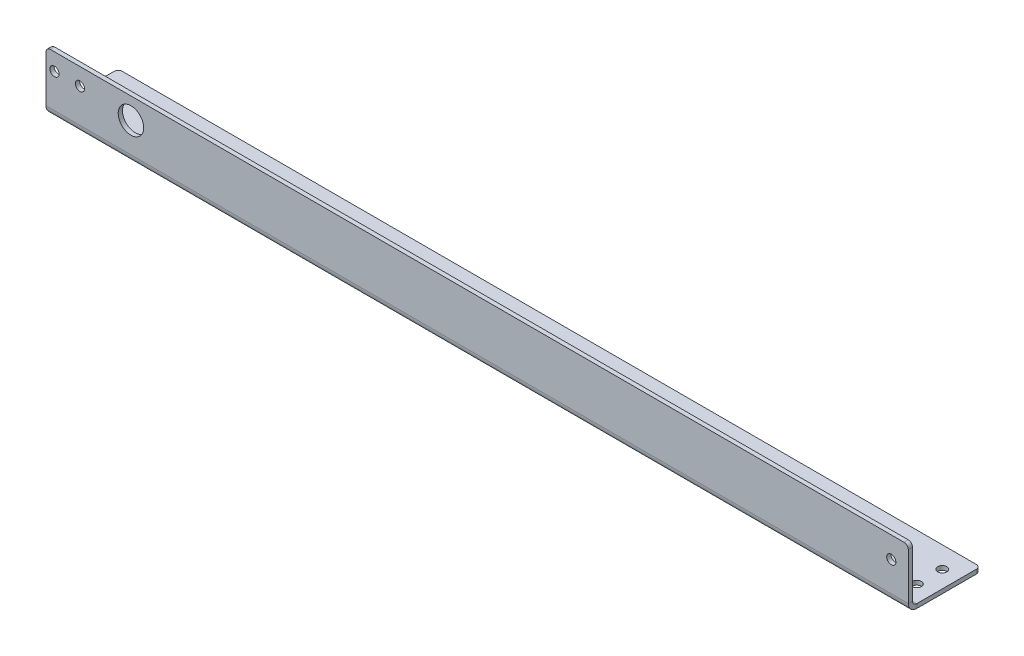
ISO-10303-21;
HEADER;
FILE_DESCRIPTION(('STEP AP214'),'2;1');
FILE_NAME('part.step','',(''),(''),'','','');
FILE_SCHEMA(('AUTOMOTIVE_DESIGN { 1 0 10303 214 1 1 1 1 }'));
ENDSEC;
DATA;
#1=APPLICATION_CONTEXT('core data for automotive mechanical design processes');
#2=APPLICATION_PROTOCOL_DEFINITION('international standard','automotive_design',2000,#1);
#3=PRODUCT_CONTEXT('',#1,'mechanical');
#4=PRODUCT('Part','Part','',(#3));
#5=PRODUCT_RELATED_PRODUCT_CATEGORY('part','',(#4));
#6=PRODUCT_DEFINITION_FORMATION('','',#4);
#7=PRODUCT_DEFINITION_CONTEXT('part definition',#1,'design');
#8=PRODUCT_DEFINITION('design','',#6,#7);
#9=PRODUCT_DEFINITION_SHAPE('','',#8);
#10=(LENGTH_UNIT() NAMED_UNIT(*) SI_UNIT(.MILLI.,.METRE.));
#11=(NAMED_UNIT(*) PLANE_ANGLE_UNIT() SI_UNIT($,.RADIAN.));
#12=(NAMED_UNIT(*) SI_UNIT($,.STERADIAN.) SOLID_ANGLE_UNIT());
#13=UNCERTAINTY_MEASURE_WITH_UNIT(LENGTH_MEASURE(1.E-05),#10,'distance_accuracy_value','');
#14=(GEOMETRIC_REPRESENTATION_CONTEXT(3) GLOBAL_UNCERTAINTY_ASSIGNED_CONTEXT((#13)) GLOBAL_UNIT_ASSIGNED_CONTEXT((#10,
#11,#12)) REPRESENTATION_CONTEXT('',''));
#15=CARTESIAN_POINT('',(0.,0.,0.));
#16=DIRECTION('',(0.,0.,1.));
#17=DIRECTION('',(1.,0.,0.));
#18=AXIS2_PLACEMENT_3D('',#15,#16,#17);
#19=CARTESIAN_POINT('',(644.525,6.35,0.));
#20=DIRECTION('',(1.,0.,0.));
#21=DIRECTION('',(0.,0.,-1.));
#22=AXIS2_PLACEMENT_3D('',#19,#20,#21);
#23=PLANE('',#22);
#24=DIRECTION('',(0.,0.,-1.));
#25=VECTOR('',#24,1.);
#26=CARTESIAN_POINT('',(644.525,6.35,0.));
#27=LINE('',#26,#25);
#28=CARTESIAN_POINT('',(644.525,6.35,0.));
#29=VERTEX_POINT('',#28);
#30=CARTESIAN_POINT('',(644.525,6.35,-3.175));
#31=VERTEX_POINT('',#30);
#32=EDGE_CURVE('E179',#29,#31,#27,.T.);
#33=ORIENTED_EDGE('',*,*,#32,.F.);
#34=CARTESIAN_POINT('',(644.525,6.35,-6.35));
#35=DIRECTION('',(1.,0.,0.));
#36=DIRECTION('',(0.,0.,-1.));
#37=AXIS2_PLACEMENT_3D('',#34,#35,#36);
#38=CIRCLE('',#37,6.35);
#39=CARTESIAN_POINT('',(644.525,0.,-6.35));
#40=VERTEX_POINT('',#39);
#41=EDGE_CURVE('E183',#40,#29,#38,.F.);
#42=ORIENTED_EDGE('',*,*,#41,.F.);
#43=DIRECTION('',(0.,-1.,0.));
#44=VECTOR('',#43,1.);
#45=CARTESIAN_POINT('',(644.525,3.175,-6.35));
#46=LINE('',#45,#44);
#47=CARTESIAN_POINT('',(644.525,3.175,-6.35));
#48=VERTEX_POINT('',#47);
#49=EDGE_CURVE('E188',#48,#40,#46,.T.);
#50=ORIENTED_EDGE('',*,*,#49,.F.);
#51=CARTESIAN_POINT('',(644.525,6.35,-6.35));
#52=DIRECTION('',(1.,0.,0.));
#53=DIRECTION('',(0.,0.,-1.));
#54=AXIS2_PLACEMENT_3D('',#51,#52,#53);
#55=CIRCLE('',#54,3.175);
#56=EDGE_CURVE('E185',#48,#31,#55,.F.);
#57=ORIENTED_EDGE('',*,*,#56,.T.);
#58=EDGE_LOOP('',(#33,#42,#50,#57));
#59=FACE_BOUND('',#58,.T.);
#60=ADVANCED_FACE('F86',(#59),#23,.T.);
#61=CARTESIAN_POINT('',(644.525,3.175,-6.35));
#62=DIRECTION('',(1.,0.,0.));
#63=DIRECTION('',(0.,0.,-1.));
#64=AXIS2_PLACEMENT_3D('',#61,#62,#63);
#65=PLANE('',#64);
#66=DIRECTION('',(0.,1.,0.));
#67=VECTOR('',#66,1.);
#68=CARTESIAN_POINT('',(644.525,0.,-3.175));
#69=LINE('',#68,#67);
#70=CARTESIAN_POINT('',(644.525,41.275,-3.175));
#71=VERTEX_POINT('',#70);
#72=EDGE_CURVE('E203',#31,#71,#69,.T.);
#73=ORIENTED_EDGE('',*,*,#72,.T.);
#74=DIRECTION('',(0.,0.,-1.));
#75=VECTOR('',#74,1.);
#76=CARTESIAN_POINT('',(644.525,41.275,-6.35));
#77=LINE('',#76,#75);
#78=CARTESIAN_POINT('',(644.525,41.275,0.));
#79=VERTEX_POINT('',#78);
#80=EDGE_CURVE('E109',#71,#79,#77,.F.);
#81=ORIENTED_EDGE('',*,*,#80,.T.);
#82=DIRECTION('',(0.,1.,0.));
#83=VECTOR('',#82,1.);
#84=CARTESIAN_POINT('',(644.525,0.,0.));
#85=LINE('',#84,#83);
#86=EDGE_CURVE('E193',#29,#79,#85,.T.);
#87=ORIENTED_EDGE('',*,*,#86,.F.);
#88=ORIENTED_EDGE('',*,*,#32,.T.);
#89=EDGE_LOOP('',(#73,#81,#87,#88));
#90=FACE_BOUND('',#89,.T.);
#91=ADVANCED_FACE('F202',(#90),#65,.T.);
#92=CARTESIAN_POINT('',(0.,0.,-6.35));
#93=DIRECTION('',(-1.,0.,0.));
#94=DIRECTION('',(0.,0.,1.));
#95=AXIS2_PLACEMENT_3D('',#92,#93,#94);
#96=PLANE('',#95);
#97=DIRECTION('',(0.,1.,0.));
#98=VECTOR('',#97,1.);
#99=CARTESIAN_POINT('',(0.,0.,-6.35));
#100=LINE('',#99,#98);
#101=CARTESIAN_POINT('',(0.,0.,-6.35));
#102=VERTEX_POINT('',#101);
#103=CARTESIAN_POINT('',(0.,3.175,-6.35));
#104=VERTEX_POINT('',#103);
#105=EDGE_CURVE('E249',#102,#104,#100,.T.);
#106=ORIENTED_EDGE('',*,*,#105,.F.);
#107=CARTESIAN_POINT('',(0.,6.35,-6.35));
#108=DIRECTION('',(1.,0.,0.));
#109=DIRECTION('',(0.,0.,-1.));
#110=AXIS2_PLACEMENT_3D('',#107,#108,#109);
#111=CIRCLE('',#110,6.35);
#112=CARTESIAN_POINT('',(0.,6.35,0.));
#113=VERTEX_POINT('',#112);
#114=EDGE_CURVE('E222',#102,#113,#111,.F.);
#115=ORIENTED_EDGE('',*,*,#114,.T.);
#116=DIRECTION('',(0.,0.,1.));
#117=VECTOR('',#116,1.);
#118=CARTESIAN_POINT('',(0.,6.35,-3.175));
#119=LINE('',#118,#117);
#120=CARTESIAN_POINT('',(0.,6.35,-3.175));
#121=VERTEX_POINT('',#120);
#122=EDGE_CURVE('E247',#121,#113,#119,.T.);
#123=ORIENTED_EDGE('',*,*,#122,.F.);
#124=CARTESIAN_POINT('',(0.,6.35,-6.35));
#125=DIRECTION('',(1.,0.,0.));
#126=DIRECTION('',(0.,0.,-1.));
#127=AXIS2_PLACEMENT_3D('',#124,#125,#126);
#128=CIRCLE('',#127,3.175);
#129=EDGE_CURVE('E228',#104,#121,#128,.F.);
#130=ORIENTED_EDGE('',*,*,#129,.F.);
#131=EDGE_LOOP('',(#106,#115,#123,#130));
#132=FACE_BOUND('',#131,.T.);
#133=ADVANCED_FACE('F296',(#132),#96,.T.);
#134=CARTESIAN_POINT('',(0.,6.35,-3.175));
#135=DIRECTION('',(-1.,0.,0.));
#136=DIRECTION('',(0.,0.,1.));
#137=AXIS2_PLACEMENT_3D('',#134,#135,#136);
#138=PLANE('',#137);
#139=DIRECTION('',(0.,0.,1.));
#140=VECTOR('',#139,1.);
#141=CARTESIAN_POINT('',(0.,3.175,-53.975));
#142=LINE('',#141,#140);
#143=CARTESIAN_POINT('',(0.,3.175,-50.8));
#144=VERTEX_POINT('',#143);
#145=EDGE_CURVE('E226',#144,#104,#142,.T.);
#146=ORIENTED_EDGE('',*,*,#145,.F.);
#147=DIRECTION('',(0.,-1.,0.));
#148=VECTOR('',#147,1.);
#149=CARTESIAN_POINT('',(0.,6.35,-50.8));
#150=LINE('',#149,#148);
#151=CARTESIAN_POINT('',(0.,0.,-50.8));
#152=VERTEX_POINT('',#151);
#153=EDGE_CURVE('E12',#144,#152,#150,.T.);
#154=ORIENTED_EDGE('',*,*,#153,.T.);
#155=DIRECTION('',(0.,0.,1.));
#156=VECTOR('',#155,1.);
#157=CARTESIAN_POINT('',(0.,0.,-53.975));
#158=LINE('',#157,#156);
#159=EDGE_CURVE('E224',#152,#102,#158,.T.);
#160=ORIENTED_EDGE('',*,*,#159,.T.);
#161=ORIENTED_EDGE('',*,*,#105,.T.);
#162=EDGE_LOOP('',(#146,#154,#160,#161));
#163=FACE_BOUND('',#162,.T.);
#164=ADVANCED_FACE('F313',(#163),#138,.T.);
#165=CARTESIAN_POINT('',(644.525,0.,-3.175));
#166=DIRECTION('',(0.,0.,1.));
#167=DIRECTION('',(1.,0.,0.));
#168=AXIS2_PLACEMENT_3D('',#165,#166,#167);
#169=PLANE('',#168);
#170=CARTESIAN_POINT('',(631.825,28.575,-3.175));
#171=DIRECTION('',(0.,0.,1.));
#172=DIRECTION('',(1.,0.,0.));
#173=AXIS2_PLACEMENT_3D('',#170,#171,#172);
#174=CIRCLE('',#173,3.429);
#175=CARTESIAN_POINT('',(635.254,28.575,-3.175));
#176=VERTEX_POINT('',#175);
#177=EDGE_CURVE('E445',#176,#176,#174,.T.);
#178=ORIENTED_EDGE('',*,*,#177,.T.);
#179=EDGE_LOOP('',(#178));
#180=FACE_BOUND('',#179,.T.);
#181=CARTESIAN_POINT('',(25.4,31.75,-3.175));
#182=DIRECTION('',(0.,0.,1.));
#183=DIRECTION('',(1.,0.,0.));
#184=AXIS2_PLACEMENT_3D('',#181,#182,#183);
#185=CIRCLE('',#184,3.42899999999999);
#186=CARTESIAN_POINT('',(28.829,31.75,-3.175));
#187=VERTEX_POINT('',#186);
#188=EDGE_CURVE('E404',#187,#187,#185,.T.);
#189=ORIENTED_EDGE('',*,*,#188,.T.);
#190=EDGE_LOOP('',(#189));
#191=FACE_BOUND('',#190,.T.);
#192=CARTESIAN_POINT('',(6.35,31.75,-3.175));
#193=DIRECTION('',(0.,0.,1.));
#194=DIRECTION('',(1.,0.,0.));
#195=AXIS2_PLACEMENT_3D('',#192,#193,#194);
#196=CIRCLE('',#195,3.429);
#197=CARTESIAN_POINT('',(9.779,31.75,-3.175));
#198=VERTEX_POINT('',#197);
#199=EDGE_CURVE('E421',#198,#198,#196,.T.);
#200=ORIENTED_EDGE('',*,*,#199,.T.);
#201=EDGE_LOOP('',(#200));
#202=FACE_BOUND('',#201,.T.);
#203=CARTESIAN_POINT('',(63.5,28.575,-3.175));
#204=DIRECTION('',(0.,0.,1.));
#205=DIRECTION('',(1.,0.,0.));
#206=AXIS2_PLACEMENT_3D('',#203,#204,#205);
#207=CIRCLE('',#206,9.52500000000001);
#208=CARTESIAN_POINT('',(73.025,28.575,-3.175));
#209=VERTEX_POINT('',#208);
#210=EDGE_CURVE('E414',#209,#209,#207,.T.);
#211=ORIENTED_EDGE('',*,*,#210,.T.);
#212=EDGE_LOOP('',(#211));
#213=FACE_BOUND('',#212,.T.);
#214=DIRECTION('',(-1.,0.,0.));
#215=VECTOR('',#214,1.);
#216=CARTESIAN_POINT('',(644.525,44.45,-3.175));
#217=LINE('',#216,#215);
#218=CARTESIAN_POINT('',(641.35,44.45,-3.175));
#219=VERTEX_POINT('',#218);
#220=CARTESIAN_POINT('',(3.17500000000004,44.45,-3.175));
#221=VERTEX_POINT('',#220);
#222=EDGE_CURVE('E244',#219,#221,#217,.T.);
#223=ORIENTED_EDGE('',*,*,#222,.F.);
#224=CARTESIAN_POINT('',(641.35,41.275,-3.175));
#225=DIRECTION('',(0.,0.,1.));
#226=DIRECTION('',(1.,0.,0.));
#227=AXIS2_PLACEMENT_3D('',#224,#225,#226);
#228=CIRCLE('',#227,3.175);
#229=EDGE_CURVE('E275',#219,#71,#228,.F.);
#230=ORIENTED_EDGE('',*,*,#229,.T.);
#231=ORIENTED_EDGE('',*,*,#72,.F.);
#232=DIRECTION('',(-1.,0.,0.));
#233=VECTOR('',#232,1.);
#234=CARTESIAN_POINT('',(644.525,6.35,-3.175));
#235=LINE('',#234,#233);
#236=EDGE_CURVE('E216',#31,#121,#235,.T.);
#237=ORIENTED_EDGE('',*,*,#236,.T.);
#238=DIRECTION('',(0.,1.,0.));
#239=VECTOR('',#238,1.);
#240=CARTESIAN_POINT('',(0.,0.,-3.175));
#241=LINE('',#240,#239);
#242=CARTESIAN_POINT('',(0.,41.275,-3.175));
#243=VERTEX_POINT('',#242);
#244=EDGE_CURVE('E217',#121,#243,#241,.T.);
#245=ORIENTED_EDGE('',*,*,#244,.T.);
#246=CARTESIAN_POINT('',(3.175,41.275,-3.175));
#247=DIRECTION('',(0.,0.,1.));
#248=DIRECTION('',(1.,0.,0.));
#249=AXIS2_PLACEMENT_3D('',#246,#247,#248);
#250=CIRCLE('',#249,3.175);
#251=EDGE_CURVE('E273',#243,#221,#250,.F.);
#252=ORIENTED_EDGE('',*,*,#251,.T.);
#253=EDGE_LOOP('',(#223,#230,#231,#237,#245,#252));
#254=FACE_BOUND('',#253,.T.);
#255=ADVANCED_FACE('F288',(#180,#191,#202,#213,#254),#169,.F.);
#256=CARTESIAN_POINT('',(644.525,44.45,0.));
#257=DIRECTION('',(0.,1.,0.));
#258=DIRECTION('',(0.,0.,1.));
#259=AXIS2_PLACEMENT_3D('',#256,#257,#258);
#260=PLANE('',#259);
#261=DIRECTION('',(-1.,0.,0.));
#262=VECTOR('',#261,1.);
#263=CARTESIAN_POINT('',(644.525,44.45,0.));
#264=LINE('',#263,#262);
#265=CARTESIAN_POINT('',(641.35,44.45,0.));
#266=VERTEX_POINT('',#265);
#267=CARTESIAN_POINT('',(3.17500000000004,44.45,0.));
#268=VERTEX_POINT('',#267);
#269=EDGE_CURVE('E199',#266,#268,#264,.T.);
#270=ORIENTED_EDGE('',*,*,#269,.F.);
#271=DIRECTION('',(0.,0.,-1.));
#272=VECTOR('',#271,1.);
#273=CARTESIAN_POINT('',(641.35,44.45,0.));
#274=LINE('',#273,#272);
#275=EDGE_CURVE('E270',#266,#219,#274,.T.);
#276=ORIENTED_EDGE('',*,*,#275,.T.);
#277=ORIENTED_EDGE('',*,*,#222,.T.);
#278=DIRECTION('',(0.,0.,-1.));
#279=VECTOR('',#278,1.);
#280=CARTESIAN_POINT('',(3.175,44.45,0.));
#281=LINE('',#280,#279);
#282=EDGE_CURVE('E268',#221,#268,#281,.F.);
#283=ORIENTED_EDGE('',*,*,#282,.T.);
#284=EDGE_LOOP('',(#270,#276,#277,#283));
#285=FACE_BOUND('',#284,.T.);
#286=ADVANCED_FACE('F349',(#285),#260,.T.);
#287=CARTESIAN_POINT('',(644.525,0.,0.));
#288=DIRECTION('',(0.,0.,1.));
#289=DIRECTION('',(1.,0.,0.));
#290=AXIS2_PLACEMENT_3D('',#287,#288,#289);
#291=PLANE('',#290);
#292=CARTESIAN_POINT('',(631.825,28.575,0.));
#293=DIRECTION('',(0.,0.,1.));
#294=DIRECTION('',(1.,0.,0.));
#295=AXIS2_PLACEMENT_3D('',#292,#293,#294);
#296=CIRCLE('',#295,3.429);
#297=CARTESIAN_POINT('',(635.254,28.575,0.));
#298=VERTEX_POINT('',#297);
#299=EDGE_CURVE('E417',#298,#298,#296,.T.);
#300=ORIENTED_EDGE('',*,*,#299,.F.);
#301=EDGE_LOOP('',(#300));
#302=FACE_BOUND('',#301,.T.);
#303=CARTESIAN_POINT('',(25.4,31.75,0.));
#304=DIRECTION('',(0.,0.,1.));
#305=DIRECTION('',(1.,0.,0.));
#306=AXIS2_PLACEMENT_3D('',#303,#304,#305);
#307=CIRCLE('',#306,3.42899999999999);
#308=CARTESIAN_POINT('',(28.829,31.75,0.));
#309=VERTEX_POINT('',#308);
#310=EDGE_CURVE('E407',#309,#309,#307,.T.);
#311=ORIENTED_EDGE('',*,*,#310,.F.);
#312=EDGE_LOOP('',(#311));
#313=FACE_BOUND('',#312,.T.);
#314=CARTESIAN_POINT('',(6.35,31.75,0.));
#315=DIRECTION('',(0.,0.,1.));
#316=DIRECTION('',(1.,0.,0.));
#317=AXIS2_PLACEMENT_3D('',#314,#315,#316);
#318=CIRCLE('',#317,3.429);
#319=CARTESIAN_POINT('',(9.779,31.75,0.));
#320=VERTEX_POINT('',#319);
#321=EDGE_CURVE('E410',#320,#320,#318,.T.);
#322=ORIENTED_EDGE('',*,*,#321,.F.);
#323=EDGE_LOOP('',(#322));
#324=FACE_BOUND('',#323,.T.);
#325=CARTESIAN_POINT('',(63.5,28.575,0.));
#326=DIRECTION('',(0.,0.,1.));
#327=DIRECTION('',(1.,0.,0.));
#328=AXIS2_PLACEMENT_3D('',#325,#326,#327);
#329=CIRCLE('',#328,9.52500000000001);
#330=CARTESIAN_POINT('',(73.025,28.575,0.));
#331=VERTEX_POINT('',#330);
#332=EDGE_CURVE('E418',#331,#331,#329,.T.);
#333=ORIENTED_EDGE('',*,*,#332,.F.);
#334=EDGE_LOOP('',(#333));
#335=FACE_BOUND('',#334,.T.);
#336=ORIENTED_EDGE('',*,*,#86,.T.);
#337=CARTESIAN_POINT('',(641.35,41.275,0.));
#338=DIRECTION('',(0.,0.,1.));
#339=DIRECTION('',(1.,0.,0.));
#340=AXIS2_PLACEMENT_3D('',#337,#338,#339);
#341=CIRCLE('',#340,3.175);
#342=EDGE_CURVE('E279',#79,#266,#341,.T.);
#343=ORIENTED_EDGE('',*,*,#342,.T.);
#344=ORIENTED_EDGE('',*,*,#269,.T.);
#345=CARTESIAN_POINT('',(3.175,41.275,0.));
#346=DIRECTION('',(0.,0.,1.));
#347=DIRECTION('',(1.,0.,0.));
#348=AXIS2_PLACEMENT_3D('',#345,#346,#347);
#349=CIRCLE('',#348,3.175);
#350=CARTESIAN_POINT('',(0.,41.275,0.));
#351=VERTEX_POINT('',#350);
#352=EDGE_CURVE('E101',#268,#351,#349,.T.);
#353=ORIENTED_EDGE('',*,*,#352,.T.);
#354=DIRECTION('',(0.,1.,0.));
#355=VECTOR('',#354,1.);
#356=CARTESIAN_POINT('',(0.,0.,0.));
#357=LINE('',#356,#355);
#358=EDGE_CURVE('E195',#113,#351,#357,.T.);
#359=ORIENTED_EDGE('',*,*,#358,.F.);
#360=DIRECTION('',(-1.,0.,0.));
#361=VECTOR('',#360,1.);
#362=CARTESIAN_POINT('',(644.525,6.35,0.));
#363=LINE('',#362,#361);
#364=EDGE_CURVE('E191',#29,#113,#363,.T.);
#365=ORIENTED_EDGE('',*,*,#364,.F.);
#366=EDGE_LOOP('',(#336,#343,#344,#353,#359,#365));
#367=FACE_BOUND('',#366,.T.);
#368=ADVANCED_FACE('F192',(#302,#313,#324,#335,#367),#291,.T.);
#369=CARTESIAN_POINT('',(644.525,6.35,-6.35));
#370=DIRECTION('',(-1.,0.,0.));
#371=DIRECTION('',(0.,0.,1.));
#372=AXIS2_PLACEMENT_3D('',#369,#370,#371);
#373=CYLINDRICAL_SURFACE('',#372,6.35);
#374=ORIENTED_EDGE('',*,*,#114,.F.);
#375=DIRECTION('',(-1.,0.,0.));
#376=VECTOR('',#375,1.);
#377=CARTESIAN_POINT('',(644.525,0.,-6.35));
#378=LINE('',#377,#376);
#379=EDGE_CURVE('E200',#40,#102,#378,.T.);
#380=ORIENTED_EDGE('',*,*,#379,.F.);
#381=ORIENTED_EDGE('',*,*,#41,.T.);
#382=ORIENTED_EDGE('',*,*,#364,.T.);
#383=EDGE_LOOP('',(#374,#380,#381,#382));
#384=FACE_BOUND('',#383,.T.);
#385=ADVANCED_FACE('F206',(#384),#373,.T.);
#386=CARTESIAN_POINT('',(644.525,0.,-53.975));
#387=DIRECTION('',(0.,-1.,0.));
#388=DIRECTION('',(0.,0.,-1.));
#389=AXIS2_PLACEMENT_3D('',#386,#387,#388);
#390=PLANE('',#389);
#391=CARTESIAN_POINT('',(12.7,0.,-19.05));
#392=DIRECTION('',(0.,-1.,0.));
#393=DIRECTION('',(0.,0.,-1.));
#394=AXIS2_PLACEMENT_3D('',#391,#392,#393);
#395=CIRCLE('',#394,3.429);
#396=CARTESIAN_POINT('',(12.7,0.,-22.479));
#397=VERTEX_POINT('',#396);
#398=EDGE_CURVE('E442',#397,#397,#395,.T.);
#399=ORIENTED_EDGE('',*,*,#398,.F.);
#400=EDGE_LOOP('',(#399));
#401=FACE_BOUND('',#400,.T.);
#402=CARTESIAN_POINT('',(12.7,0.,-38.1));
#403=DIRECTION('',(0.,-1.,0.));
#404=DIRECTION('',(0.,0.,-1.));
#405=AXIS2_PLACEMENT_3D('',#402,#403,#404);
#406=CIRCLE('',#405,3.429);
#407=CARTESIAN_POINT('',(12.7,0.,-41.529));
#408=VERTEX_POINT('',#407);
#409=EDGE_CURVE('E436',#408,#408,#406,.T.);
#410=ORIENTED_EDGE('',*,*,#409,.F.);
#411=EDGE_LOOP('',(#410));
#412=FACE_BOUND('',#411,.T.);
#413=CARTESIAN_POINT('',(631.825,0.,-38.1));
#414=DIRECTION('',(0.,-1.,0.));
#415=DIRECTION('',(0.,0.,-1.));
#416=AXIS2_PLACEMENT_3D('',#413,#414,#415);
#417=CIRCLE('',#416,3.429);
#418=CARTESIAN_POINT('',(631.825,0.,-41.529));
#419=VERTEX_POINT('',#418);
#420=EDGE_CURVE('E430',#419,#419,#417,.T.);
#421=ORIENTED_EDGE('',*,*,#420,.F.);
#422=EDGE_LOOP('',(#421));
#423=FACE_BOUND('',#422,.T.);
#424=CARTESIAN_POINT('',(631.825,0.,-19.05));
#425=DIRECTION('',(0.,-1.,0.));
#426=DIRECTION('',(0.,0.,-1.));
#427=AXIS2_PLACEMENT_3D('',#424,#425,#426);
#428=CIRCLE('',#427,3.429);
#429=CARTESIAN_POINT('',(631.825,0.,-22.479));
#430=VERTEX_POINT('',#429);
#431=EDGE_CURVE('E429',#430,#430,#428,.T.);
#432=ORIENTED_EDGE('',*,*,#431,.F.);
#433=EDGE_LOOP('',(#432));
#434=FACE_BOUND('',#433,.T.);
#435=DIRECTION('',(-1.,0.,0.));
#436=VECTOR('',#435,1.);
#437=CARTESIAN_POINT('',(644.525,0.,-53.975));
#438=LINE('',#437,#436);
#439=CARTESIAN_POINT('',(641.35,0.,-53.975));
#440=VERTEX_POINT('',#439);
#441=CARTESIAN_POINT('',(3.17500000000004,0.,-53.975));
#442=VERTEX_POINT('',#441);
#443=EDGE_CURVE('E239',#440,#442,#438,.T.);
#444=ORIENTED_EDGE('',*,*,#443,.F.);
#445=CARTESIAN_POINT('',(641.35,0.,-50.8));
#446=DIRECTION('',(0.,-1.,0.));
#447=DIRECTION('',(0.,0.,-1.));
#448=AXIS2_PLACEMENT_3D('',#445,#446,#447);
#449=CIRCLE('',#448,3.175);
#450=CARTESIAN_POINT('',(644.525,0.,-50.8));
#451=VERTEX_POINT('',#450);
#452=EDGE_CURVE('E260',#440,#451,#449,.T.);
#453=ORIENTED_EDGE('',*,*,#452,.T.);
#454=DIRECTION('',(0.,0.,1.));
#455=VECTOR('',#454,1.);
#456=CARTESIAN_POINT('',(644.525,0.,-53.975));
#457=LINE('',#456,#455);
#458=EDGE_CURVE('E208',#451,#40,#457,.T.);
#459=ORIENTED_EDGE('',*,*,#458,.T.);
#460=ORIENTED_EDGE('',*,*,#379,.T.);
#461=ORIENTED_EDGE('',*,*,#159,.F.);
#462=CARTESIAN_POINT('',(3.175,0.,-50.8));
#463=DIRECTION('',(0.,-1.,0.));
#464=DIRECTION('',(0.,0.,-1.));
#465=AXIS2_PLACEMENT_3D('',#462,#463,#464);
#466=CIRCLE('',#465,3.175);
#467=EDGE_CURVE('E258',#152,#442,#466,.T.);
#468=ORIENTED_EDGE('',*,*,#467,.T.);
#469=EDGE_LOOP('',(#444,#453,#459,#460,#461,#468));
#470=FACE_BOUND('',#469,.T.);
#471=ADVANCED_FACE('F302',(#401,#412,#423,#434,#470),#390,.T.);
#472=CARTESIAN_POINT('',(644.525,3.175,-53.975));
#473=DIRECTION('',(0.,0.,-1.));
#474=DIRECTION('',(-1.,0.,0.));
#475=AXIS2_PLACEMENT_3D('',#472,#473,#474);
#476=PLANE('',#475);
#477=DIRECTION('',(-1.,0.,0.));
#478=VECTOR('',#477,1.);
#479=CARTESIAN_POINT('',(644.525,3.175,-53.975));
#480=LINE('',#479,#478);
#481=CARTESIAN_POINT('',(641.35,3.175,-53.975));
#482=VERTEX_POINT('',#481);
#483=CARTESIAN_POINT('',(3.17500000000004,3.175,-53.975));
#484=VERTEX_POINT('',#483);
#485=EDGE_CURVE('E236',#482,#484,#480,.T.);
#486=ORIENTED_EDGE('',*,*,#485,.F.);
#487=DIRECTION('',(0.,-1.,0.));
#488=VECTOR('',#487,1.);
#489=CARTESIAN_POINT('',(641.35,3.175,-53.975));
#490=LINE('',#489,#488);
#491=EDGE_CURVE('E255',#482,#440,#490,.T.);
#492=ORIENTED_EDGE('',*,*,#491,.T.);
#493=ORIENTED_EDGE('',*,*,#443,.T.);
#494=DIRECTION('',(0.,-1.,0.));
#495=VECTOR('',#494,1.);
#496=CARTESIAN_POINT('',(3.17500000000004,3.175,-53.975));
#497=LINE('',#496,#495);
#498=EDGE_CURVE('E187',#442,#484,#497,.F.);
#499=ORIENTED_EDGE('',*,*,#498,.T.);
#500=EDGE_LOOP('',(#486,#492,#493,#499));
#501=FACE_BOUND('',#500,.T.);
#502=ADVANCED_FACE('F318',(#501),#476,.T.);
#503=CARTESIAN_POINT('',(644.525,3.175,-53.975));
#504=DIRECTION('',(0.,-1.,0.));
#505=DIRECTION('',(0.,0.,-1.));
#506=AXIS2_PLACEMENT_3D('',#503,#504,#505);
#507=PLANE('',#506);
#508=CARTESIAN_POINT('',(12.7,3.175,-19.05));
#509=DIRECTION('',(0.,-1.,0.));
#510=DIRECTION('',(0.,0.,-1.));
#511=AXIS2_PLACEMENT_3D('',#508,#509,#510);
#512=CIRCLE('',#511,3.429);
#513=CARTESIAN_POINT('',(12.7,3.175,-22.479));
#514=VERTEX_POINT('',#513);
#515=EDGE_CURVE('E439',#514,#514,#512,.T.);
#516=ORIENTED_EDGE('',*,*,#515,.T.);
#517=EDGE_LOOP('',(#516));
#518=FACE_BOUND('',#517,.T.);
#519=CARTESIAN_POINT('',(12.7,3.175,-38.1));
#520=DIRECTION('',(0.,-1.,0.));
#521=DIRECTION('',(0.,0.,-1.));
#522=AXIS2_PLACEMENT_3D('',#519,#520,#521);
#523=CIRCLE('',#522,3.429);
#524=CARTESIAN_POINT('',(12.7,3.175,-41.529));
#525=VERTEX_POINT('',#524);
#526=EDGE_CURVE('E433',#525,#525,#523,.T.);
#527=ORIENTED_EDGE('',*,*,#526,.T.);
#528=EDGE_LOOP('',(#527));
#529=FACE_BOUND('',#528,.T.);
#530=CARTESIAN_POINT('',(631.825,3.175,-38.1));
#531=DIRECTION('',(0.,-1.,0.));
#532=DIRECTION('',(0.,0.,-1.));
#533=AXIS2_PLACEMENT_3D('',#530,#531,#532);
#534=CIRCLE('',#533,3.429);
#535=CARTESIAN_POINT('',(631.825,3.175,-41.529));
#536=VERTEX_POINT('',#535);
#537=EDGE_CURVE('E426',#536,#536,#534,.T.);
#538=ORIENTED_EDGE('',*,*,#537,.T.);
#539=EDGE_LOOP('',(#538));
#540=FACE_BOUND('',#539,.T.);
#541=CARTESIAN_POINT('',(631.825,3.175,-19.05));
#542=DIRECTION('',(0.,-1.,0.));
#543=DIRECTION('',(0.,0.,-1.));
#544=AXIS2_PLACEMENT_3D('',#541,#542,#543);
#545=CIRCLE('',#544,3.429);
#546=CARTESIAN_POINT('',(631.825,3.175,-22.479));
#547=VERTEX_POINT('',#546);
#548=EDGE_CURVE('E220',#547,#547,#545,.T.);
#549=ORIENTED_EDGE('',*,*,#548,.T.);
#550=EDGE_LOOP('',(#549));
#551=FACE_BOUND('',#550,.T.);
#552=DIRECTION('',(0.,0.,1.));
#553=VECTOR('',#552,1.);
#554=CARTESIAN_POINT('',(644.525,3.175,-53.975));
#555=LINE('',#554,#553);
#556=CARTESIAN_POINT('',(644.525,3.175,-50.8));
#557=VERTEX_POINT('',#556);
#558=EDGE_CURVE('E210',#557,#48,#555,.T.);
#559=ORIENTED_EDGE('',*,*,#558,.F.);
#560=CARTESIAN_POINT('',(641.35,3.175,-50.8));
#561=DIRECTION('',(0.,-1.,0.));
#562=DIRECTION('',(0.,0.,-1.));
#563=AXIS2_PLACEMENT_3D('',#560,#561,#562);
#564=CIRCLE('',#563,3.175);
#565=EDGE_CURVE('E266',#557,#482,#564,.F.);
#566=ORIENTED_EDGE('',*,*,#565,.T.);
#567=ORIENTED_EDGE('',*,*,#485,.T.);
#568=CARTESIAN_POINT('',(3.175,3.175,-50.8));
#569=DIRECTION('',(0.,-1.,0.));
#570=DIRECTION('',(0.,0.,-1.));
#571=AXIS2_PLACEMENT_3D('',#568,#569,#570);
#572=CIRCLE('',#571,3.175);
#573=EDGE_CURVE('E264',#484,#144,#572,.F.);
#574=ORIENTED_EDGE('',*,*,#573,.T.);
#575=ORIENTED_EDGE('',*,*,#145,.T.);
#576=DIRECTION('',(-1.,0.,0.));
#577=VECTOR('',#576,1.);
#578=CARTESIAN_POINT('',(644.525,3.175,-6.35));
#579=LINE('',#578,#577);
#580=EDGE_CURVE('E233',#48,#104,#579,.T.);
#581=ORIENTED_EDGE('',*,*,#580,.F.);
#582=EDGE_LOOP('',(#559,#566,#567,#574,#575,#581));
#583=FACE_BOUND('',#582,.T.);
#584=ADVANCED_FACE('F309',(#518,#529,#540,#551,#583),#507,.F.);
#585=CARTESIAN_POINT('',(644.525,6.35,-6.35));
#586=DIRECTION('',(-1.,0.,0.));
#587=DIRECTION('',(0.,0.,1.));
#588=AXIS2_PLACEMENT_3D('',#585,#586,#587);
#589=CYLINDRICAL_SURFACE('',#588,3.175);
#590=ORIENTED_EDGE('',*,*,#129,.T.);
#591=ORIENTED_EDGE('',*,*,#236,.F.);
#592=ORIENTED_EDGE('',*,*,#56,.F.);
#593=ORIENTED_EDGE('',*,*,#580,.T.);
#594=EDGE_LOOP('',(#590,#591,#592,#593));
#595=FACE_BOUND('',#594,.T.);
#596=ADVANCED_FACE('F291',(#595),#589,.F.);
#597=CARTESIAN_POINT('',(644.525,6.35,-6.35));
#598=DIRECTION('',(1.,0.,0.));
#599=DIRECTION('',(0.,0.,-1.));
#600=AXIS2_PLACEMENT_3D('',#597,#598,#599);
#601=PLANE('',#600);
#602=ORIENTED_EDGE('',*,*,#458,.F.);
#603=DIRECTION('',(0.,-1.,0.));
#604=VECTOR('',#603,1.);
#605=CARTESIAN_POINT('',(644.525,6.35,-50.8));
#606=LINE('',#605,#604);
#607=EDGE_CURVE('E262',#451,#557,#606,.F.);
#608=ORIENTED_EDGE('',*,*,#607,.T.);
#609=ORIENTED_EDGE('',*,*,#558,.T.);
#610=ORIENTED_EDGE('',*,*,#49,.T.);
#611=EDGE_LOOP('',(#602,#608,#609,#610));
#612=FACE_BOUND('',#611,.T.);
#613=ADVANCED_FACE('F306',(#612),#601,.T.);
#614=CARTESIAN_POINT('',(0.,6.35,-6.35));
#615=DIRECTION('',(1.,0.,0.));
#616=DIRECTION('',(0.,0.,-1.));
#617=AXIS2_PLACEMENT_3D('',#614,#615,#616);
#618=PLANE('',#617);
#619=ORIENTED_EDGE('',*,*,#358,.T.);
#620=DIRECTION('',(0.,0.,-1.));
#621=VECTOR('',#620,1.);
#622=CARTESIAN_POINT('',(0.,41.275,-3.175));
#623=LINE('',#622,#621);
#624=EDGE_CURVE('E94',#351,#243,#623,.T.);
#625=ORIENTED_EDGE('',*,*,#624,.T.);
#626=ORIENTED_EDGE('',*,*,#244,.F.);
#627=ORIENTED_EDGE('',*,*,#122,.T.);
#628=EDGE_LOOP('',(#619,#625,#626,#627));
#629=FACE_BOUND('',#628,.T.);
#630=ADVANCED_FACE('F284',(#629),#618,.F.);
#631=CARTESIAN_POINT('',(631.825,3.175,-19.05));
#632=DIRECTION('',(0.,-1.,0.));
#633=DIRECTION('',(0.,0.,-1.));
#634=AXIS2_PLACEMENT_3D('',#631,#632,#633);
#635=CYLINDRICAL_SURFACE('',#634,3.429);
#636=ORIENTED_EDGE('',*,*,#548,.F.);
#637=EDGE_LOOP('',(#636));
#638=FACE_BOUND('',#637,.T.);
#639=ORIENTED_EDGE('',*,*,#431,.T.);
#640=EDGE_LOOP('',(#639));
#641=FACE_BOUND('',#640,.T.);
#642=ADVANCED_FACE('F371',(#638,#641),#635,.F.);
#643=CARTESIAN_POINT('',(631.825,3.175,-38.1));
#644=DIRECTION('',(0.,-1.,0.));
#645=DIRECTION('',(0.,0.,-1.));
#646=AXIS2_PLACEMENT_3D('',#643,#644,#645);
#647=CYLINDRICAL_SURFACE('',#646,3.429);
#648=ORIENTED_EDGE('',*,*,#537,.F.);
#649=EDGE_LOOP('',(#648));
#650=FACE_BOUND('',#649,.T.);
#651=ORIENTED_EDGE('',*,*,#420,.T.);
#652=EDGE_LOOP('',(#651));
#653=FACE_BOUND('',#652,.T.);
#654=ADVANCED_FACE('F376',(#650,#653),#647,.F.);
#655=CARTESIAN_POINT('',(12.7,3.175,-38.1));
#656=DIRECTION('',(0.,-1.,0.));
#657=DIRECTION('',(0.,0.,-1.));
#658=AXIS2_PLACEMENT_3D('',#655,#656,#657);
#659=CYLINDRICAL_SURFACE('',#658,3.429);
#660=ORIENTED_EDGE('',*,*,#526,.F.);
#661=EDGE_LOOP('',(#660));
#662=FACE_BOUND('',#661,.T.);
#663=ORIENTED_EDGE('',*,*,#409,.T.);
#664=EDGE_LOOP('',(#663));
#665=FACE_BOUND('',#664,.T.);
#666=ADVANCED_FACE('F382',(#662,#665),#659,.F.);
#667=CARTESIAN_POINT('',(12.7,3.175,-19.05));
#668=DIRECTION('',(0.,-1.,0.));
#669=DIRECTION('',(0.,0.,-1.));
#670=AXIS2_PLACEMENT_3D('',#667,#668,#669);
#671=CYLINDRICAL_SURFACE('',#670,3.429);
#672=ORIENTED_EDGE('',*,*,#515,.F.);
#673=EDGE_LOOP('',(#672));
#674=FACE_BOUND('',#673,.T.);
#675=ORIENTED_EDGE('',*,*,#398,.T.);
#676=EDGE_LOOP('',(#675));
#677=FACE_BOUND('',#676,.T.);
#678=ADVANCED_FACE('F378',(#674,#677),#671,.F.);
#679=CARTESIAN_POINT('',(63.5,28.575,-3.175));
#680=DIRECTION('',(0.,0.,1.));
#681=DIRECTION('',(1.,0.,0.));
#682=AXIS2_PLACEMENT_3D('',#679,#680,#681);
#683=CYLINDRICAL_SURFACE('',#682,9.52500000000001);
#684=ORIENTED_EDGE('',*,*,#210,.F.);
#685=EDGE_LOOP('',(#684));
#686=FACE_BOUND('',#685,.T.);
#687=ORIENTED_EDGE('',*,*,#332,.T.);
#688=EDGE_LOOP('',(#687));
#689=FACE_BOUND('',#688,.T.);
#690=ADVANCED_FACE('F381',(#686,#689),#683,.F.);
#691=CARTESIAN_POINT('',(6.35,31.75,-3.175));
#692=DIRECTION('',(0.,0.,1.));
#693=DIRECTION('',(1.,0.,0.));
#694=AXIS2_PLACEMENT_3D('',#691,#692,#693);
#695=CYLINDRICAL_SURFACE('',#694,3.429);
#696=ORIENTED_EDGE('',*,*,#199,.F.);
#697=EDGE_LOOP('',(#696));
#698=FACE_BOUND('',#697,.T.);
#699=ORIENTED_EDGE('',*,*,#321,.T.);
#700=EDGE_LOOP('',(#699));
#701=FACE_BOUND('',#700,.T.);
#702=ADVANCED_FACE('F390',(#698,#701),#695,.F.);
#703=CARTESIAN_POINT('',(25.4,31.75,-3.175));
#704=DIRECTION('',(0.,0.,1.));
#705=DIRECTION('',(1.,0.,0.));
#706=AXIS2_PLACEMENT_3D('',#703,#704,#705);
#707=CYLINDRICAL_SURFACE('',#706,3.42899999999999);
#708=ORIENTED_EDGE('',*,*,#188,.F.);
#709=EDGE_LOOP('',(#708));
#710=FACE_BOUND('',#709,.T.);
#711=ORIENTED_EDGE('',*,*,#310,.T.);
#712=EDGE_LOOP('',(#711));
#713=FACE_BOUND('',#712,.T.);
#714=ADVANCED_FACE('F333',(#710,#713),#707,.F.);
#715=CARTESIAN_POINT('',(631.825,28.575,-3.175));
#716=DIRECTION('',(0.,0.,1.));
#717=DIRECTION('',(1.,0.,0.));
#718=AXIS2_PLACEMENT_3D('',#715,#716,#717);
#719=CYLINDRICAL_SURFACE('',#718,3.429);
#720=ORIENTED_EDGE('',*,*,#177,.F.);
#721=EDGE_LOOP('',(#720));
#722=FACE_BOUND('',#721,.T.);
#723=ORIENTED_EDGE('',*,*,#299,.T.);
#724=EDGE_LOOP('',(#723));
#725=FACE_BOUND('',#724,.T.);
#726=ADVANCED_FACE('F324',(#722,#725),#719,.F.);
#727=CARTESIAN_POINT('',(641.35,3.175,-50.8));
#728=DIRECTION('',(0.,-1.,0.));
#729=DIRECTION('',(0.,0.,-1.));
#730=AXIS2_PLACEMENT_3D('',#727,#728,#729);
#731=CYLINDRICAL_SURFACE('',#730,3.175);
#732=ORIENTED_EDGE('',*,*,#565,.F.);
#733=ORIENTED_EDGE('',*,*,#607,.F.);
#734=ORIENTED_EDGE('',*,*,#452,.F.);
#735=ORIENTED_EDGE('',*,*,#491,.F.);
#736=EDGE_LOOP('',(#732,#733,#734,#735));
#737=FACE_BOUND('',#736,.T.);
#738=ADVANCED_FACE('F321',(#737),#731,.T.);
#739=CARTESIAN_POINT('',(641.35,41.275,0.));
#740=DIRECTION('',(0.,0.,-1.));
#741=DIRECTION('',(-1.,0.,0.));
#742=AXIS2_PLACEMENT_3D('',#739,#740,#741);
#743=CYLINDRICAL_SURFACE('',#742,3.175);
#744=ORIENTED_EDGE('',*,*,#342,.F.);
#745=ORIENTED_EDGE('',*,*,#80,.F.);
#746=ORIENTED_EDGE('',*,*,#229,.F.);
#747=ORIENTED_EDGE('',*,*,#275,.F.);
#748=EDGE_LOOP('',(#744,#745,#746,#747));
#749=FACE_BOUND('',#748,.T.);
#750=ADVANCED_FACE('F323',(#749),#743,.T.);
#751=CARTESIAN_POINT('',(3.175,41.275,-6.35));
#752=DIRECTION('',(0.,0.,1.));
#753=DIRECTION('',(1.,0.,0.));
#754=AXIS2_PLACEMENT_3D('',#751,#752,#753);
#755=CYLINDRICAL_SURFACE('',#754,3.175);
#756=ORIENTED_EDGE('',*,*,#352,.F.);
#757=ORIENTED_EDGE('',*,*,#282,.F.);
#758=ORIENTED_EDGE('',*,*,#251,.F.);
#759=ORIENTED_EDGE('',*,*,#624,.F.);
#760=EDGE_LOOP('',(#756,#757,#758,#759));
#761=FACE_BOUND('',#760,.T.);
#762=ADVANCED_FACE('F330',(#761),#755,.T.);
#763=CARTESIAN_POINT('',(3.175,6.35,-50.8));
#764=DIRECTION('',(0.,-1.,0.));
#765=DIRECTION('',(0.,0.,-1.));
#766=AXIS2_PLACEMENT_3D('',#763,#764,#765);
#767=CYLINDRICAL_SURFACE('',#766,3.175);
#768=ORIENTED_EDGE('',*,*,#573,.F.);
#769=ORIENTED_EDGE('',*,*,#498,.F.);
#770=ORIENTED_EDGE('',*,*,#467,.F.);
#771=ORIENTED_EDGE('',*,*,#153,.F.);
#772=EDGE_LOOP('',(#768,#769,#770,#771));
#773=FACE_BOUND('',#772,.T.);
#774=ADVANCED_FACE('F88',(#773),#767,.T.);
#775=CLOSED_SHELL('',(#60,#91,#133,#164,#255,#286,#368,#385,#471,#502,#584,#596,#613,#630,#642,
#654,#666,#678,#690,#702,#714,#726,#738,#750,#762,#774));
#776=MANIFOLD_SOLID_BREP('B2',#775);
#777=ADVANCED_BREP_SHAPE_REPRESENTATION('',(#18,#776),#14);
#778=SHAPE_DEFINITION_REPRESENTATION(#9,#777);
ENDSEC;
END-ISO-10303-21;
